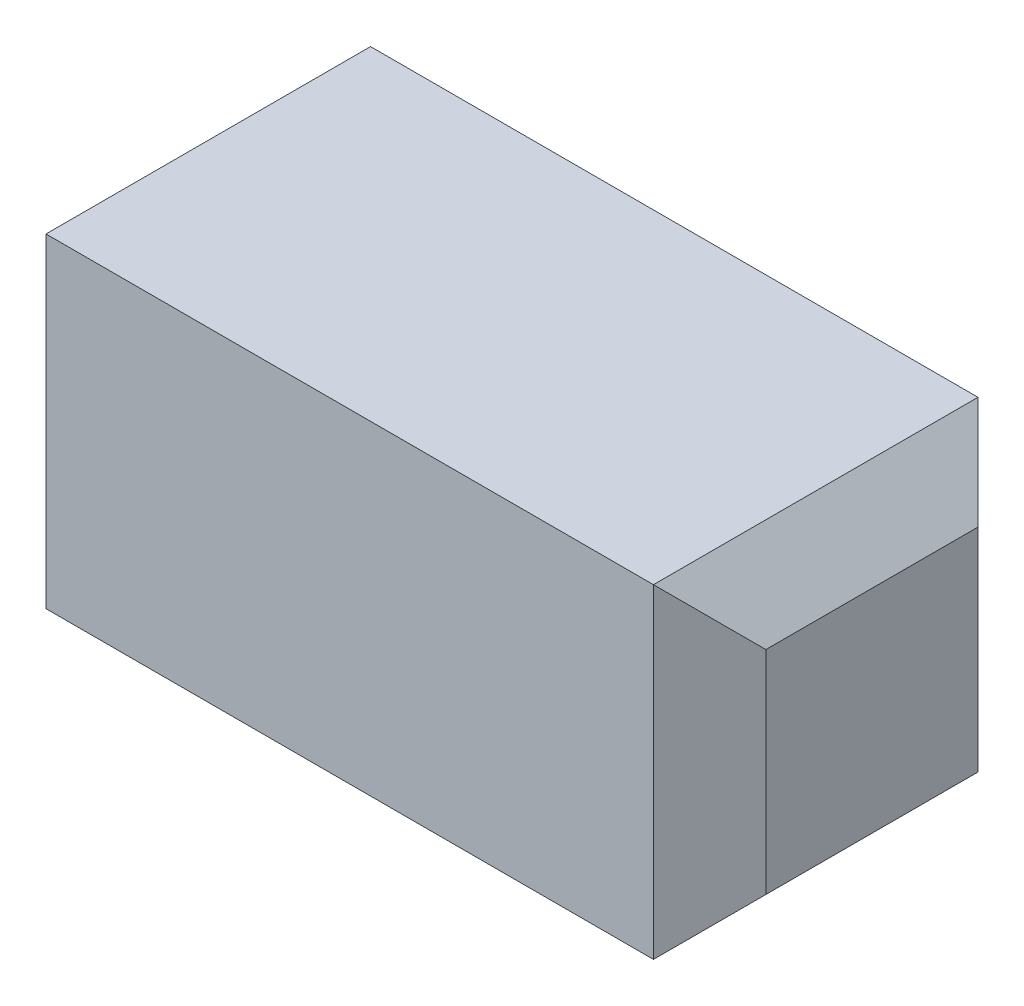
ISO-10303-21;
HEADER;
FILE_DESCRIPTION(('STEP AP214'),'2;1');
FILE_NAME('part.step','',(''),(''),'','','');
FILE_SCHEMA(('AUTOMOTIVE_DESIGN { 1 0 10303 214 1 1 1 1 }'));
ENDSEC;
DATA;
#1=APPLICATION_CONTEXT('core data for automotive mechanical design processes');
#2=APPLICATION_PROTOCOL_DEFINITION('international standard','automotive_design',2000,#1);
#3=PRODUCT_CONTEXT('',#1,'mechanical');
#4=PRODUCT('Part','Part','',(#3));
#5=PRODUCT_RELATED_PRODUCT_CATEGORY('part','',(#4));
#6=PRODUCT_DEFINITION_FORMATION('','',#4);
#7=PRODUCT_DEFINITION_CONTEXT('part definition',#1,'design');
#8=PRODUCT_DEFINITION('design','',#6,#7);
#9=PRODUCT_DEFINITION_SHAPE('','',#8);
#10=(LENGTH_UNIT() NAMED_UNIT(*) SI_UNIT(.MILLI.,.METRE.));
#11=(NAMED_UNIT(*) PLANE_ANGLE_UNIT() SI_UNIT($,.RADIAN.));
#12=(NAMED_UNIT(*) SI_UNIT($,.STERADIAN.) SOLID_ANGLE_UNIT());
#13=UNCERTAINTY_MEASURE_WITH_UNIT(LENGTH_MEASURE(1.E-05),#10,'distance_accuracy_value','');
#14=(GEOMETRIC_REPRESENTATION_CONTEXT(3) GLOBAL_UNCERTAINTY_ASSIGNED_CONTEXT((#13)) GLOBAL_UNIT_ASSIGNED_CONTEXT((#10,
#11,#12)) REPRESENTATION_CONTEXT('',''));
#15=CARTESIAN_POINT('',(0.,0.,0.));
#16=DIRECTION('',(0.,0.,1.));
#17=DIRECTION('',(1.,0.,0.));
#18=AXIS2_PLACEMENT_3D('',#15,#16,#17);
#19=CARTESIAN_POINT('',(9.76,0.,0.));
#20=DIRECTION('',(0.,0.,-1.));
#21=DIRECTION('',(-1.,0.,0.));
#22=AXIS2_PLACEMENT_3D('',#19,#20,#21);
#23=PLANE('',#22);
#24=DIRECTION('',(-1.,0.,0.));
#25=VECTOR('',#24,1.);
#26=CARTESIAN_POINT('',(9.76,4.40032549932388,0.));
#27=LINE('',#26,#25);
#28=CARTESIAN_POINT('',(8.998,4.40032549932388,0.));
#29=VERTEX_POINT('',#28);
#30=CARTESIAN_POINT('',(0.762000000000001,4.40032549932388,0.));
#31=VERTEX_POINT('',#30);
#32=EDGE_CURVE('E151',#29,#31,#27,.T.);
#33=ORIENTED_EDGE('',*,*,#32,.T.);
#34=DIRECTION('',(0.,-1.,0.));
#35=VECTOR('',#34,1.);
#36=CARTESIAN_POINT('',(0.762000000000001,0.,0.));
#37=LINE('',#36,#35);
#38=CARTESIAN_POINT('',(0.762000000000001,0.,0.));
#39=VERTEX_POINT('',#38);
#40=EDGE_CURVE('E160',#31,#39,#37,.T.);
#41=ORIENTED_EDGE('',*,*,#40,.T.);
#42=DIRECTION('',(-1.,0.,0.));
#43=VECTOR('',#42,1.);
#44=CARTESIAN_POINT('',(9.76,0.,0.));
#45=LINE('',#44,#43);
#46=CARTESIAN_POINT('',(8.998,0.,0.));
#47=VERTEX_POINT('',#46);
#48=EDGE_CURVE('E129',#47,#39,#45,.T.);
#49=ORIENTED_EDGE('',*,*,#48,.F.);
#50=DIRECTION('',(0.,1.,0.));
#51=VECTOR('',#50,1.);
#52=CARTESIAN_POINT('',(8.998,0.,0.));
#53=LINE('',#52,#51);
#54=EDGE_CURVE('E162',#47,#29,#53,.T.);
#55=ORIENTED_EDGE('',*,*,#54,.T.);
#56=EDGE_LOOP('',(#33,#41,#49,#55));
#57=FACE_BOUND('',#56,.T.);
#58=ADVANCED_FACE('F41',(#57),#23,.F.);
#59=CARTESIAN_POINT('',(9.76,0.,0.));
#60=DIRECTION('',(0.,1.,0.));
#61=DIRECTION('',(0.,0.,1.));
#62=AXIS2_PLACEMENT_3D('',#59,#60,#61);
#63=PLANE('',#62);
#64=ORIENTED_EDGE('',*,*,#48,.T.);
#65=DIRECTION('',(0.,0.,-1.));
#66=VECTOR('',#65,1.);
#67=CARTESIAN_POINT('',(0.762000000000001,0.,-4.40032549932388));
#68=LINE('',#67,#66);
#69=CARTESIAN_POINT('',(0.762000000000001,0.,-4.40032549932388));
#70=VERTEX_POINT('',#69);
#71=EDGE_CURVE('E128',#39,#70,#68,.T.);
#72=ORIENTED_EDGE('',*,*,#71,.T.);
#73=DIRECTION('',(-1.,0.,0.));
#74=VECTOR('',#73,1.);
#75=CARTESIAN_POINT('',(9.76,0.,-4.40032549932388));
#76=LINE('',#75,#74);
#77=CARTESIAN_POINT('',(8.998,0.,-4.40032549932388));
#78=VERTEX_POINT('',#77);
#79=EDGE_CURVE('E111',#78,#70,#76,.T.);
#80=ORIENTED_EDGE('',*,*,#79,.F.);
#81=DIRECTION('',(0.,0.,1.));
#82=VECTOR('',#81,1.);
#83=CARTESIAN_POINT('',(8.998,0.,0.));
#84=LINE('',#83,#82);
#85=EDGE_CURVE('E125',#78,#47,#84,.T.);
#86=ORIENTED_EDGE('',*,*,#85,.T.);
#87=EDGE_LOOP('',(#64,#72,#80,#86));
#88=FACE_BOUND('',#87,.T.);
#89=ADVANCED_FACE('F124',(#88),#63,.F.);
#90=CARTESIAN_POINT('',(9.76,0.,-4.40032549932388));
#91=DIRECTION('',(0.,0.,1.));
#92=DIRECTION('',(1.,0.,0.));
#93=AXIS2_PLACEMENT_3D('',#90,#91,#92);
#94=PLANE('',#93);
#95=ORIENTED_EDGE('',*,*,#79,.T.);
#96=DIRECTION('',(0.,1.,0.));
#97=VECTOR('',#96,1.);
#98=CARTESIAN_POINT('',(0.762000000000001,4.40032549932388,-4.40032549932388));
#99=LINE('',#98,#97);
#100=CARTESIAN_POINT('',(0.762000000000001,4.40032549932388,-4.40032549932388));
#101=VERTEX_POINT('',#100);
#102=EDGE_CURVE('E117',#70,#101,#99,.T.);
#103=ORIENTED_EDGE('',*,*,#102,.T.);
#104=DIRECTION('',(-1.,0.,0.));
#105=VECTOR('',#104,1.);
#106=CARTESIAN_POINT('',(9.76,4.40032549932388,-4.40032549932388));
#107=LINE('',#106,#105);
#108=CARTESIAN_POINT('',(8.998,4.40032549932388,-4.40032549932388));
#109=VERTEX_POINT('',#108);
#110=EDGE_CURVE('E113',#109,#101,#107,.T.);
#111=ORIENTED_EDGE('',*,*,#110,.F.);
#112=DIRECTION('',(0.,-1.,0.));
#113=VECTOR('',#112,1.);
#114=CARTESIAN_POINT('',(8.998,0.,-4.40032549932388));
#115=LINE('',#114,#113);
#116=EDGE_CURVE('E108',#109,#78,#115,.T.);
#117=ORIENTED_EDGE('',*,*,#116,.T.);
#118=EDGE_LOOP('',(#95,#103,#111,#117));
#119=FACE_BOUND('',#118,.T.);
#120=ADVANCED_FACE('F110',(#119),#94,.F.);
#121=CARTESIAN_POINT('',(9.76,4.40032549932388,0.));
#122=DIRECTION('',(0.,-1.,0.));
#123=DIRECTION('',(0.,0.,-1.));
#124=AXIS2_PLACEMENT_3D('',#121,#122,#123);
#125=PLANE('',#124);
#126=ORIENTED_EDGE('',*,*,#110,.T.);
#127=DIRECTION('',(0.,0.,1.));
#128=VECTOR('',#127,1.);
#129=CARTESIAN_POINT('',(0.762000000000001,4.40032549932388,0.));
#130=LINE('',#129,#128);
#131=EDGE_CURVE('E164',#101,#31,#130,.T.);
#132=ORIENTED_EDGE('',*,*,#131,.T.);
#133=ORIENTED_EDGE('',*,*,#32,.F.);
#134=DIRECTION('',(0.,0.,-1.));
#135=VECTOR('',#134,1.);
#136=CARTESIAN_POINT('',(8.998,4.40032549932388,0.));
#137=LINE('',#136,#135);
#138=EDGE_CURVE('E166',#29,#109,#137,.T.);
#139=ORIENTED_EDGE('',*,*,#138,.T.);
#140=EDGE_LOOP('',(#126,#132,#133,#139));
#141=FACE_BOUND('',#140,.T.);
#142=ADVANCED_FACE('F204',(#141),#125,.F.);
#143=CARTESIAN_POINT('',(9.76,0.,0.));
#144=DIRECTION('',(-1.,0.,0.));
#145=DIRECTION('',(0.,0.,1.));
#146=AXIS2_PLACEMENT_3D('',#143,#144,#145);
#147=PLANE('',#146);
#148=DIRECTION('',(0.,1.,0.));
#149=VECTOR('',#148,1.);
#150=CARTESIAN_POINT('',(9.76,0.,-3.63832549932388));
#151=LINE('',#150,#149);
#152=CARTESIAN_POINT('',(9.76,0.762000000000001,-3.63832549932388));
#153=VERTEX_POINT('',#152);
#154=CARTESIAN_POINT('',(9.76,3.63832549932388,-3.63832549932388));
#155=VERTEX_POINT('',#154);
#156=EDGE_CURVE('E51',#153,#155,#151,.T.);
#157=ORIENTED_EDGE('',*,*,#156,.T.);
#158=DIRECTION('',(0.,0.,1.));
#159=VECTOR('',#158,1.);
#160=CARTESIAN_POINT('',(9.76,3.63832549932388,0.));
#161=LINE('',#160,#159);
#162=CARTESIAN_POINT('',(9.76,3.63832549932388,-0.762000000000001));
#163=VERTEX_POINT('',#162);
#164=EDGE_CURVE('E11',#155,#163,#161,.T.);
#165=ORIENTED_EDGE('',*,*,#164,.T.);
#166=DIRECTION('',(0.,-1.,0.));
#167=VECTOR('',#166,1.);
#168=CARTESIAN_POINT('',(9.76,0.,-0.762000000000001));
#169=LINE('',#168,#167);
#170=CARTESIAN_POINT('',(9.76,0.762000000000001,-0.762000000000001));
#171=VERTEX_POINT('',#170);
#172=EDGE_CURVE('E158',#163,#171,#169,.T.);
#173=ORIENTED_EDGE('',*,*,#172,.T.);
#174=DIRECTION('',(0.,0.,-1.));
#175=VECTOR('',#174,1.);
#176=CARTESIAN_POINT('',(9.76,0.762000000000001,0.));
#177=LINE('',#176,#175);
#178=EDGE_CURVE('E62',#171,#153,#177,.T.);
#179=ORIENTED_EDGE('',*,*,#178,.T.);
#180=EDGE_LOOP('',(#157,#165,#173,#179));
#181=FACE_BOUND('',#180,.T.);
#182=ADVANCED_FACE('F210',(#181),#147,.F.);
#183=CARTESIAN_POINT('',(0.,0.,0.));
#184=DIRECTION('',(-1.,0.,0.));
#185=DIRECTION('',(0.,0.,1.));
#186=AXIS2_PLACEMENT_3D('',#183,#184,#185);
#187=PLANE('',#186);
#188=DIRECTION('',(0.,-1.,0.));
#189=VECTOR('',#188,1.);
#190=CARTESIAN_POINT('',(0.,0.,-3.63832549932388));
#191=LINE('',#190,#189);
#192=CARTESIAN_POINT('',(0.,3.63832549932388,-3.63832549932388));
#193=VERTEX_POINT('',#192);
#194=CARTESIAN_POINT('',(0.,0.762000000000004,-3.63832549932388));
#195=VERTEX_POINT('',#194);
#196=EDGE_CURVE('E171',#193,#195,#191,.T.);
#197=ORIENTED_EDGE('',*,*,#196,.T.);
#198=DIRECTION('',(0.,0.,1.));
#199=VECTOR('',#198,1.);
#200=CARTESIAN_POINT('',(0.,0.762000000000004,0.));
#201=LINE('',#200,#199);
#202=CARTESIAN_POINT('',(0.,0.762000000000004,-0.762000000000004));
#203=VERTEX_POINT('',#202);
#204=EDGE_CURVE('E118',#195,#203,#201,.T.);
#205=ORIENTED_EDGE('',*,*,#204,.T.);
#206=DIRECTION('',(0.,1.,0.));
#207=VECTOR('',#206,1.);
#208=CARTESIAN_POINT('',(0.,4.40032549932388,-0.762000000000004));
#209=LINE('',#208,#207);
#210=CARTESIAN_POINT('',(0.,3.63832549932388,-0.762000000000004));
#211=VERTEX_POINT('',#210);
#212=EDGE_CURVE('E175',#203,#211,#209,.T.);
#213=ORIENTED_EDGE('',*,*,#212,.T.);
#214=DIRECTION('',(0.,0.,-1.));
#215=VECTOR('',#214,1.);
#216=CARTESIAN_POINT('',(0.,3.63832549932388,-4.40032549932388));
#217=LINE('',#216,#215);
#218=EDGE_CURVE('E173',#211,#193,#217,.T.);
#219=ORIENTED_EDGE('',*,*,#218,.T.);
#220=EDGE_LOOP('',(#197,#205,#213,#219));
#221=FACE_BOUND('',#220,.T.);
#222=ADVANCED_FACE('F212',(#221),#187,.T.);
#223=CARTESIAN_POINT('',(0.762000000000001,4.40032549932388,0.));
#224=DIRECTION('',(-0.707106781186549,0.707106781186546,0.));
#225=DIRECTION('',(0.,0.,-1.));
#226=AXIS2_PLACEMENT_3D('',#223,#224,#225);
#227=PLANE('',#226);
#228=DIRECTION('',(-0.577350269189624,-0.577350269189627,0.577350269189627));
#229=VECTOR('',#228,1.);
#230=CARTESIAN_POINT('',(-0.704775166441292,2.93355033288259,-2.93355033288259));
#231=LINE('',#230,#229);
#232=EDGE_CURVE('E152',#193,#101,#231,.F.);
#233=ORIENTED_EDGE('',*,*,#232,.F.);
#234=ORIENTED_EDGE('',*,*,#218,.F.);
#235=DIRECTION('',(-0.577350269189624,-0.577350269189627,-0.577350269189627));
#236=VECTOR('',#235,1.);
#237=CARTESIAN_POINT('',(-0.704775166441292,2.93355033288259,-1.4667751664413));
#238=LINE('',#237,#236);
#239=EDGE_CURVE('E148',#31,#211,#238,.T.);
#240=ORIENTED_EDGE('',*,*,#239,.F.);
#241=ORIENTED_EDGE('',*,*,#131,.F.);
#242=EDGE_LOOP('',(#233,#234,#240,#241));
#243=FACE_BOUND('',#242,.T.);
#244=ADVANCED_FACE('F191',(#243),#227,.T.);
#245=CARTESIAN_POINT('',(0.762000000000001,0.,0.));
#246=DIRECTION('',(-0.707106781186549,0.,0.707106781186546));
#247=DIRECTION('',(0.,1.,0.));
#248=AXIS2_PLACEMENT_3D('',#245,#246,#247);
#249=PLANE('',#248);
#250=ORIENTED_EDGE('',*,*,#239,.T.);
#251=ORIENTED_EDGE('',*,*,#212,.F.);
#252=DIRECTION('',(0.577350269189624,-0.577350269189627,0.577350269189627));
#253=VECTOR('',#252,1.);
#254=CARTESIAN_POINT('',(0.762000000000001,0.,0.));
#255=LINE('',#254,#253);
#256=EDGE_CURVE('E139',#39,#203,#255,.F.);
#257=ORIENTED_EDGE('',*,*,#256,.F.);
#258=ORIENTED_EDGE('',*,*,#40,.F.);
#259=EDGE_LOOP('',(#250,#251,#257,#258));
#260=FACE_BOUND('',#259,.T.);
#261=ADVANCED_FACE('F195',(#260),#249,.T.);
#262=CARTESIAN_POINT('',(0.762000000000001,0.,-4.40032549932388));
#263=DIRECTION('',(-0.707106781186549,0.,-0.707106781186546));
#264=DIRECTION('',(0.,-1.,0.));
#265=AXIS2_PLACEMENT_3D('',#262,#263,#264);
#266=PLANE('',#265);
#267=ORIENTED_EDGE('',*,*,#232,.T.);
#268=ORIENTED_EDGE('',*,*,#102,.F.);
#269=DIRECTION('',(-0.577350269189624,0.577350269189627,0.577350269189627));
#270=VECTOR('',#269,1.);
#271=CARTESIAN_POINT('',(0.762000000000001,0.,-4.40032549932388));
#272=LINE('',#271,#270);
#273=EDGE_CURVE('E138',#195,#70,#272,.F.);
#274=ORIENTED_EDGE('',*,*,#273,.F.);
#275=ORIENTED_EDGE('',*,*,#196,.F.);
#276=EDGE_LOOP('',(#267,#268,#274,#275));
#277=FACE_BOUND('',#276,.T.);
#278=ADVANCED_FACE('F203',(#277),#266,.T.);
#279=CARTESIAN_POINT('',(0.762000000000001,0.,0.));
#280=DIRECTION('',(-0.707106781186549,-0.707106781186546,0.));
#281=DIRECTION('',(0.,0.,1.));
#282=AXIS2_PLACEMENT_3D('',#279,#280,#281);
#283=PLANE('',#282);
#284=ORIENTED_EDGE('',*,*,#256,.T.);
#285=ORIENTED_EDGE('',*,*,#204,.F.);
#286=ORIENTED_EDGE('',*,*,#273,.T.);
#287=ORIENTED_EDGE('',*,*,#71,.F.);
#288=EDGE_LOOP('',(#284,#285,#286,#287));
#289=FACE_BOUND('',#288,.T.);
#290=ADVANCED_FACE('F198',(#289),#283,.T.);
#291=CARTESIAN_POINT('',(9.76,0.762000000000001,0.));
#292=DIRECTION('',(-0.707106781186546,0.707106781186549,0.));
#293=DIRECTION('',(0.,0.,-1.));
#294=AXIS2_PLACEMENT_3D('',#291,#292,#293);
#295=PLANE('',#294);
#296=DIRECTION('',(0.577350269189628,0.577350269189625,-0.577350269189625));
#297=VECTOR('',#296,1.);
#298=CARTESIAN_POINT('',(9.506,0.508000000000001,-0.508000000000001));
#299=LINE('',#298,#297);
#300=EDGE_CURVE('E134',#47,#171,#299,.T.);
#301=ORIENTED_EDGE('',*,*,#300,.F.);
#302=ORIENTED_EDGE('',*,*,#85,.F.);
#303=DIRECTION('',(0.577350269189628,0.577350269189625,0.577350269189625));
#304=VECTOR('',#303,1.);
#305=CARTESIAN_POINT('',(10.9727751664413,1.97477516644129,-2.42555033288259));
#306=LINE('',#305,#304);
#307=EDGE_CURVE('E46',#153,#78,#306,.F.);
#308=ORIENTED_EDGE('',*,*,#307,.F.);
#309=ORIENTED_EDGE('',*,*,#178,.F.);
#310=EDGE_LOOP('',(#301,#302,#308,#309));
#311=FACE_BOUND('',#310,.T.);
#312=ADVANCED_FACE('F44',(#311),#295,.F.);
#313=CARTESIAN_POINT('',(9.76,0.,-3.63832549932388));
#314=DIRECTION('',(-0.707106781186546,0.,0.707106781186549));
#315=DIRECTION('',(0.,1.,0.));
#316=AXIS2_PLACEMENT_3D('',#313,#314,#315);
#317=PLANE('',#316);
#318=ORIENTED_EDGE('',*,*,#307,.T.);
#319=ORIENTED_EDGE('',*,*,#116,.F.);
#320=DIRECTION('',(0.577350269189628,-0.577350269189625,0.577350269189625));
#321=VECTOR('',#320,1.);
#322=CARTESIAN_POINT('',(10.9727751664413,2.42555033288259,-2.42555033288259));
#323=LINE('',#322,#321);
#324=EDGE_CURVE('E141',#155,#109,#323,.F.);
#325=ORIENTED_EDGE('',*,*,#324,.F.);
#326=ORIENTED_EDGE('',*,*,#156,.F.);
#327=EDGE_LOOP('',(#318,#319,#325,#326));
#328=FACE_BOUND('',#327,.T.);
#329=ADVANCED_FACE('F137',(#328),#317,.F.);
#330=CARTESIAN_POINT('',(9.76,0.,-0.762000000000001));
#331=DIRECTION('',(-0.707106781186546,0.,-0.707106781186549));
#332=DIRECTION('',(0.,-1.,0.));
#333=AXIS2_PLACEMENT_3D('',#330,#331,#332);
#334=PLANE('',#333);
#335=ORIENTED_EDGE('',*,*,#300,.T.);
#336=ORIENTED_EDGE('',*,*,#172,.F.);
#337=DIRECTION('',(-0.577350269189628,0.577350269189625,0.577350269189625));
#338=VECTOR('',#337,1.);
#339=CARTESIAN_POINT('',(10.9727751664413,2.42555033288259,-1.97477516644129));
#340=LINE('',#339,#338);
#341=EDGE_CURVE('E144',#29,#163,#340,.F.);
#342=ORIENTED_EDGE('',*,*,#341,.F.);
#343=ORIENTED_EDGE('',*,*,#54,.F.);
#344=EDGE_LOOP('',(#335,#336,#342,#343));
#345=FACE_BOUND('',#344,.T.);
#346=ADVANCED_FACE('F209',(#345),#334,.F.);
#347=CARTESIAN_POINT('',(9.76,3.63832549932388,0.));
#348=DIRECTION('',(-0.707106781186546,-0.707106781186549,0.));
#349=DIRECTION('',(0.,0.,1.));
#350=AXIS2_PLACEMENT_3D('',#347,#348,#349);
#351=PLANE('',#350);
#352=ORIENTED_EDGE('',*,*,#324,.T.);
#353=ORIENTED_EDGE('',*,*,#138,.F.);
#354=ORIENTED_EDGE('',*,*,#341,.T.);
#355=ORIENTED_EDGE('',*,*,#164,.F.);
#356=EDGE_LOOP('',(#352,#353,#354,#355));
#357=FACE_BOUND('',#356,.T.);
#358=ADVANCED_FACE('F207',(#357),#351,.F.);
#359=CLOSED_SHELL('',(#58,#89,#120,#142,#182,#222,#244,#261,#278,#290,#312,#329,#346,#358));
#360=MANIFOLD_SOLID_BREP('B2',#359);
#361=ADVANCED_BREP_SHAPE_REPRESENTATION('',(#18,#360),#14);
#362=SHAPE_DEFINITION_REPRESENTATION(#9,#361);
ENDSEC;
END-ISO-10303-21;
